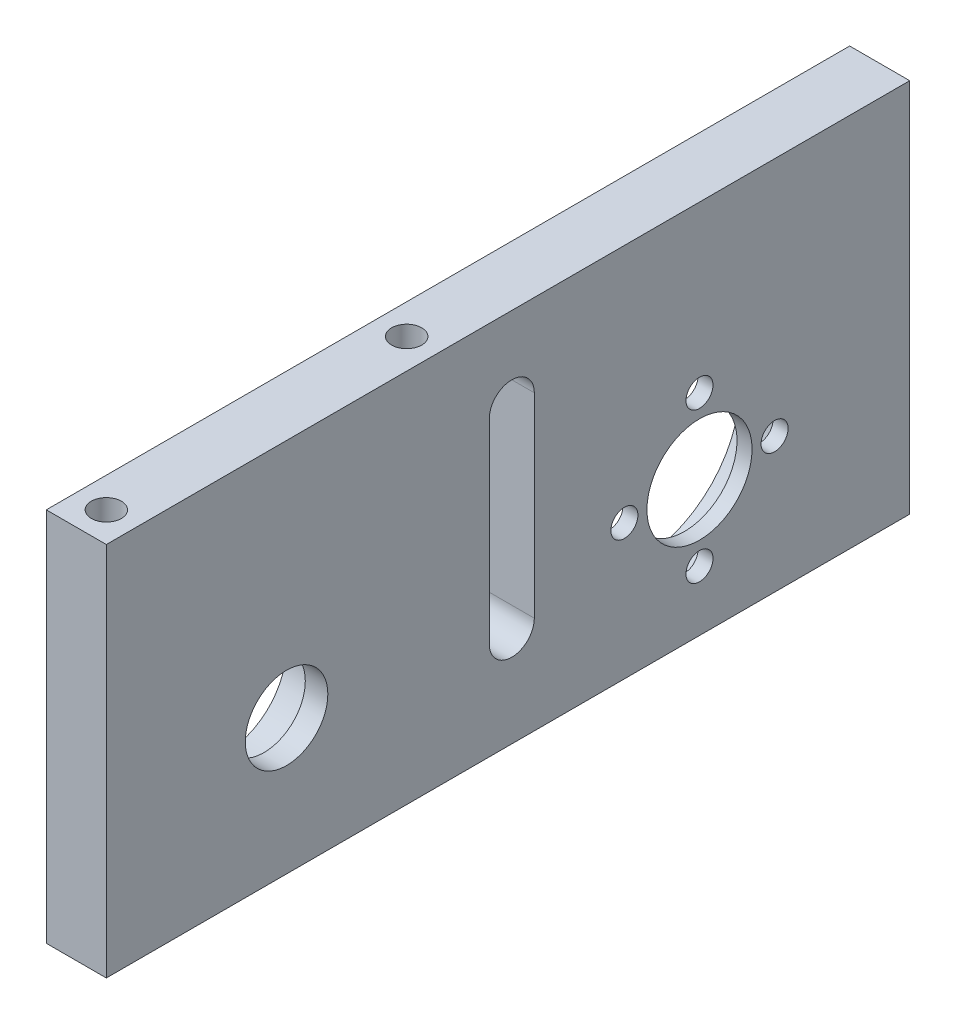
ISO-10303-21;
HEADER;
FILE_DESCRIPTION(('STEP AP214'),'2;1');
FILE_NAME('part.step','',(''),(''),'','','');
FILE_SCHEMA(('AUTOMOTIVE_DESIGN { 1 0 10303 214 1 1 1 1 }'));
ENDSEC;
DATA;
#1=APPLICATION_CONTEXT('core data for automotive mechanical design processes');
#2=APPLICATION_PROTOCOL_DEFINITION('international standard','automotive_design',2000,#1);
#3=PRODUCT_CONTEXT('',#1,'mechanical');
#4=PRODUCT('Part','Part','',(#3));
#5=PRODUCT_RELATED_PRODUCT_CATEGORY('part','',(#4));
#6=PRODUCT_DEFINITION_FORMATION('','',#4);
#7=PRODUCT_DEFINITION_CONTEXT('part definition',#1,'design');
#8=PRODUCT_DEFINITION('design','',#6,#7);
#9=PRODUCT_DEFINITION_SHAPE('','',#8);
#10=(LENGTH_UNIT() NAMED_UNIT(*) SI_UNIT(.MILLI.,.METRE.));
#11=(NAMED_UNIT(*) PLANE_ANGLE_UNIT() SI_UNIT($,.RADIAN.));
#12=(NAMED_UNIT(*) SI_UNIT($,.STERADIAN.) SOLID_ANGLE_UNIT());
#13=UNCERTAINTY_MEASURE_WITH_UNIT(LENGTH_MEASURE(1.E-05),#10,'distance_accuracy_value','');
#14=(GEOMETRIC_REPRESENTATION_CONTEXT(3) GLOBAL_UNCERTAINTY_ASSIGNED_CONTEXT((#13)) GLOBAL_UNIT_ASSIGNED_CONTEXT((#10,
#11,#12)) REPRESENTATION_CONTEXT('',''));
#15=CARTESIAN_POINT('',(0.,0.,0.));
#16=DIRECTION('',(0.,0.,1.));
#17=DIRECTION('',(1.,0.,0.));
#18=AXIS2_PLACEMENT_3D('',#15,#16,#17);
#19=CARTESIAN_POINT('',(-21.,18.,-30.));
#20=DIRECTION('',(1.,0.,0.));
#21=DIRECTION('',(0.,0.,-1.));
#22=AXIS2_PLACEMENT_3D('',#19,#20,#21);
#23=CYLINDRICAL_SURFACE('',#22,7.95);
#24=CARTESIAN_POINT('',(-19.,18.,-30.));
#25=DIRECTION('',(-1.,0.,0.));
#26=DIRECTION('',(0.,0.,1.));
#27=AXIS2_PLACEMENT_3D('',#24,#25,#26);
#28=CIRCLE('',#27,7.95);
#29=CARTESIAN_POINT('',(-19.,18.,-22.05));
#30=VERTEX_POINT('',#29);
#31=EDGE_CURVE('E242',#30,#30,#28,.T.);
#32=ORIENTED_EDGE('',*,*,#31,.T.);
#33=EDGE_LOOP('',(#32));
#34=FACE_BOUND('',#33,.T.);
#35=CARTESIAN_POINT('',(-14.,18.,-30.));
#36=DIRECTION('',(1.,0.,0.));
#37=DIRECTION('',(0.,0.,-1.));
#38=AXIS2_PLACEMENT_3D('',#35,#36,#37);
#39=CIRCLE('',#38,7.95);
#40=CARTESIAN_POINT('',(-14.,18.,-37.95));
#41=VERTEX_POINT('',#40);
#42=EDGE_CURVE('E12',#41,#41,#39,.F.);
#43=ORIENTED_EDGE('',*,*,#42,.F.);
#44=EDGE_LOOP('',(#43));
#45=FACE_BOUND('',#44,.T.);
#46=ADVANCED_FACE('F47',(#34,#45),#23,.F.);
#47=CARTESIAN_POINT('',(-9.,18.,-75.));
#48=DIRECTION('',(-1.,0.,0.));
#49=DIRECTION('',(0.,0.,1.));
#50=AXIS2_PLACEMENT_3D('',#47,#48,#49);
#51=CYLINDRICAL_SURFACE('',#50,1.79999999999999);
#52=CARTESIAN_POINT('',(-11.,18.,-75.));
#53=DIRECTION('',(1.,0.,0.));
#54=DIRECTION('',(0.,0.,-1.));
#55=AXIS2_PLACEMENT_3D('',#52,#53,#54);
#56=CIRCLE('',#55,1.79999999999999);
#57=CARTESIAN_POINT('',(-11.,18.,-76.8));
#58=VERTEX_POINT('',#57);
#59=EDGE_CURVE('E161',#58,#58,#56,.T.);
#60=ORIENTED_EDGE('',*,*,#59,.T.);
#61=EDGE_LOOP('',(#60));
#62=FACE_BOUND('',#61,.T.);
#63=CARTESIAN_POINT('',(-13.,18.,-75.));
#64=DIRECTION('',(-1.,0.,0.));
#65=DIRECTION('',(0.,0.,1.));
#66=AXIS2_PLACEMENT_3D('',#63,#64,#65);
#67=CIRCLE('',#66,1.79999999999999);
#68=CARTESIAN_POINT('',(-13.,18.,-73.2));
#69=VERTEX_POINT('',#68);
#70=EDGE_CURVE('E152',#69,#69,#67,.T.);
#71=ORIENTED_EDGE('',*,*,#70,.T.);
#72=EDGE_LOOP('',(#71));
#73=FACE_BOUND('',#72,.T.);
#74=ADVANCED_FACE('F265',(#62,#73),#51,.F.);
#75=CARTESIAN_POINT('',(-9.,7.99999999999999,-85.));
#76=DIRECTION('',(-1.,0.,0.));
#77=DIRECTION('',(0.,0.,1.));
#78=AXIS2_PLACEMENT_3D('',#75,#76,#77);
#79=CYLINDRICAL_SURFACE('',#78,1.79999999999999);
#80=CARTESIAN_POINT('',(-11.,7.99999999999999,-85.));
#81=DIRECTION('',(1.,0.,0.));
#82=DIRECTION('',(0.,0.,-1.));
#83=AXIS2_PLACEMENT_3D('',#80,#81,#82);
#84=CIRCLE('',#83,1.79999999999999);
#85=CARTESIAN_POINT('',(-11.,7.99999999999999,-86.8));
#86=VERTEX_POINT('',#85);
#87=EDGE_CURVE('E198',#86,#86,#84,.T.);
#88=ORIENTED_EDGE('',*,*,#87,.T.);
#89=EDGE_LOOP('',(#88));
#90=FACE_BOUND('',#89,.T.);
#91=CARTESIAN_POINT('',(-13.,7.99999999999999,-85.));
#92=DIRECTION('',(-1.,0.,0.));
#93=DIRECTION('',(0.,0.,1.));
#94=AXIS2_PLACEMENT_3D('',#91,#92,#93);
#95=CIRCLE('',#94,1.79999999999999);
#96=CARTESIAN_POINT('',(-13.,7.99999999999999,-83.2));
#97=VERTEX_POINT('',#96);
#98=EDGE_CURVE('E155',#97,#97,#95,.T.);
#99=ORIENTED_EDGE('',*,*,#98,.T.);
#100=EDGE_LOOP('',(#99));
#101=FACE_BOUND('',#100,.T.);
#102=ADVANCED_FACE('F270',(#90,#101),#79,.F.);
#103=CARTESIAN_POINT('',(-9.,28.,-85.));
#104=DIRECTION('',(-1.,0.,0.));
#105=DIRECTION('',(0.,0.,1.));
#106=AXIS2_PLACEMENT_3D('',#103,#104,#105);
#107=CYLINDRICAL_SURFACE('',#106,1.79999999999999);
#108=CARTESIAN_POINT('',(-11.,28.,-85.));
#109=DIRECTION('',(1.,0.,0.));
#110=DIRECTION('',(0.,0.,-1.));
#111=AXIS2_PLACEMENT_3D('',#108,#109,#110);
#112=CIRCLE('',#111,1.79999999999999);
#113=CARTESIAN_POINT('',(-11.,28.,-86.8));
#114=VERTEX_POINT('',#113);
#115=EDGE_CURVE('E201',#114,#114,#112,.T.);
#116=ORIENTED_EDGE('',*,*,#115,.T.);
#117=EDGE_LOOP('',(#116));
#118=FACE_BOUND('',#117,.T.);
#119=CARTESIAN_POINT('',(-13.,28.,-85.));
#120=DIRECTION('',(-1.,0.,0.));
#121=DIRECTION('',(0.,0.,1.));
#122=AXIS2_PLACEMENT_3D('',#119,#120,#121);
#123=CIRCLE('',#122,1.79999999999999);
#124=CARTESIAN_POINT('',(-13.,28.,-83.2));
#125=VERTEX_POINT('',#124);
#126=EDGE_CURVE('E149',#125,#125,#123,.T.);
#127=ORIENTED_EDGE('',*,*,#126,.T.);
#128=EDGE_LOOP('',(#127));
#129=FACE_BOUND('',#128,.T.);
#130=ADVANCED_FACE('F261',(#118,#129),#107,.F.);
#131=CARTESIAN_POINT('',(-9.,18.,-95.));
#132=DIRECTION('',(-1.,0.,0.));
#133=DIRECTION('',(0.,0.,1.));
#134=AXIS2_PLACEMENT_3D('',#131,#132,#133);
#135=CYLINDRICAL_SURFACE('',#134,1.79999999999999);
#136=CARTESIAN_POINT('',(-11.,18.,-95.));
#137=DIRECTION('',(1.,0.,0.));
#138=DIRECTION('',(0.,0.,-1.));
#139=AXIS2_PLACEMENT_3D('',#136,#137,#138);
#140=CIRCLE('',#139,1.79999999999999);
#141=CARTESIAN_POINT('',(-11.,18.,-96.8));
#142=VERTEX_POINT('',#141);
#143=EDGE_CURVE('E180',#142,#142,#140,.T.);
#144=ORIENTED_EDGE('',*,*,#143,.T.);
#145=EDGE_LOOP('',(#144));
#146=FACE_BOUND('',#145,.T.);
#147=CARTESIAN_POINT('',(-13.,18.,-95.));
#148=DIRECTION('',(-1.,0.,0.));
#149=DIRECTION('',(0.,0.,1.));
#150=AXIS2_PLACEMENT_3D('',#147,#148,#149);
#151=CIRCLE('',#150,1.79999999999999);
#152=CARTESIAN_POINT('',(-13.,18.,-93.2));
#153=VERTEX_POINT('',#152);
#154=EDGE_CURVE('E146',#153,#153,#151,.T.);
#155=ORIENTED_EDGE('',*,*,#154,.T.);
#156=EDGE_LOOP('',(#155));
#157=FACE_BOUND('',#156,.T.);
#158=ADVANCED_FACE('F255',(#146,#157),#135,.F.);
#159=CARTESIAN_POINT('',(-19.,50.,0.));
#160=DIRECTION('',(-1.,0.,0.));
#161=DIRECTION('',(0.,0.,1.));
#162=AXIS2_PLACEMENT_3D('',#159,#160,#161);
#163=PLANE('',#162);
#164=ORIENTED_EDGE('',*,*,#31,.F.);
#165=EDGE_LOOP('',(#164));
#166=FACE_BOUND('',#165,.T.);
#167=CARTESIAN_POINT('',(-19.,13.,-60.));
#168=DIRECTION('',(-1.,0.,0.));
#169=DIRECTION('',(0.,0.,1.));
#170=AXIS2_PLACEMENT_3D('',#167,#168,#169);
#171=CIRCLE('',#170,3.);
#172=CARTESIAN_POINT('',(-19.,13.,-63.));
#173=VERTEX_POINT('',#172);
#174=CARTESIAN_POINT('',(-19.,13.,-57.));
#175=VERTEX_POINT('',#174);
#176=EDGE_CURVE('E62',#173,#175,#171,.T.);
#177=ORIENTED_EDGE('',*,*,#176,.F.);
#178=DIRECTION('',(0.,-1.,0.));
#179=VECTOR('',#178,1.);
#180=CARTESIAN_POINT('',(-19.,0.,-63.));
#181=LINE('',#180,#179);
#182=CARTESIAN_POINT('',(-19.,39.,-63.));
#183=VERTEX_POINT('',#182);
#184=EDGE_CURVE('E130',#183,#173,#181,.T.);
#185=ORIENTED_EDGE('',*,*,#184,.F.);
#186=CARTESIAN_POINT('',(-19.,39.,-60.));
#187=DIRECTION('',(-1.,0.,0.));
#188=DIRECTION('',(0.,0.,1.));
#189=AXIS2_PLACEMENT_3D('',#186,#187,#188);
#190=CIRCLE('',#189,3.);
#191=CARTESIAN_POINT('',(-19.,39.,-57.));
#192=VERTEX_POINT('',#191);
#193=EDGE_CURVE('E115',#192,#183,#190,.T.);
#194=ORIENTED_EDGE('',*,*,#193,.F.);
#195=DIRECTION('',(0.,-1.,0.));
#196=VECTOR('',#195,1.);
#197=CARTESIAN_POINT('',(-19.,0.,-57.));
#198=LINE('',#197,#196);
#199=EDGE_CURVE('E124',#192,#175,#198,.T.);
#200=ORIENTED_EDGE('',*,*,#199,.T.);
#201=EDGE_LOOP('',(#177,#185,#194,#200));
#202=FACE_BOUND('',#201,.T.);
#203=CARTESIAN_POINT('',(-19.,18.,-85.));
#204=DIRECTION('',(-1.,0.,0.));
#205=DIRECTION('',(0.,0.,1.));
#206=AXIS2_PLACEMENT_3D('',#203,#204,#205);
#207=CIRCLE('',#206,13.4);
#208=CARTESIAN_POINT('',(-19.,18.,-71.6));
#209=VERTEX_POINT('',#208);
#210=EDGE_CURVE('E145',#209,#209,#207,.T.);
#211=ORIENTED_EDGE('',*,*,#210,.F.);
#212=EDGE_LOOP('',(#211));
#213=FACE_BOUND('',#212,.T.);
#214=DIRECTION('',(0.,0.,-1.));
#215=VECTOR('',#214,1.);
#216=CARTESIAN_POINT('',(-19.,0.,0.));
#217=LINE('',#216,#215);
#218=CARTESIAN_POINT('',(-19.,0.,-6.));
#219=VERTEX_POINT('',#218);
#220=CARTESIAN_POINT('',(-19.,0.,-113.));
#221=VERTEX_POINT('',#220);
#222=EDGE_CURVE('E176',#219,#221,#217,.T.);
#223=ORIENTED_EDGE('',*,*,#222,.F.);
#224=DIRECTION('',(0.,-1.,0.));
#225=VECTOR('',#224,1.);
#226=CARTESIAN_POINT('',(-19.,50.,-6.));
#227=LINE('',#226,#225);
#228=CARTESIAN_POINT('',(-19.,50.,-6.));
#229=VERTEX_POINT('',#228);
#230=EDGE_CURVE('E193',#229,#219,#227,.T.);
#231=ORIENTED_EDGE('',*,*,#230,.F.);
#232=DIRECTION('',(0.,0.,-1.));
#233=VECTOR('',#232,1.);
#234=CARTESIAN_POINT('',(-19.,50.,0.));
#235=LINE('',#234,#233);
#236=CARTESIAN_POINT('',(-19.,50.,-113.));
#237=VERTEX_POINT('',#236);
#238=EDGE_CURVE('E164',#229,#237,#235,.T.);
#239=ORIENTED_EDGE('',*,*,#238,.T.);
#240=DIRECTION('',(0.,-1.,0.));
#241=VECTOR('',#240,1.);
#242=CARTESIAN_POINT('',(-19.,50.,-113.));
#243=LINE('',#242,#241);
#244=EDGE_CURVE('E175',#237,#221,#243,.T.);
#245=ORIENTED_EDGE('',*,*,#244,.T.);
#246=EDGE_LOOP('',(#223,#231,#239,#245));
#247=FACE_BOUND('',#246,.T.);
#248=ADVANCED_FACE('F49',(#166,#202,#213,#247),#163,.T.);
#249=CARTESIAN_POINT('',(0.,50.,-6.));
#250=DIRECTION('',(0.,0.,-1.));
#251=DIRECTION('',(-1.,0.,0.));
#252=AXIS2_PLACEMENT_3D('',#249,#250,#251);
#253=PLANE('',#252);
#254=DIRECTION('',(1.,0.,0.));
#255=VECTOR('',#254,1.);
#256=CARTESIAN_POINT('',(0.,0.,-6.));
#257=LINE('',#256,#255);
#258=CARTESIAN_POINT('',(-11.,0.,-6.));
#259=VERTEX_POINT('',#258);
#260=EDGE_CURVE('E179',#219,#259,#257,.T.);
#261=ORIENTED_EDGE('',*,*,#260,.T.);
#262=DIRECTION('',(0.,-1.,0.));
#263=VECTOR('',#262,1.);
#264=CARTESIAN_POINT('',(-11.,50.,-6.));
#265=LINE('',#264,#263);
#266=CARTESIAN_POINT('',(-11.,50.,-6.));
#267=VERTEX_POINT('',#266);
#268=EDGE_CURVE('E191',#267,#259,#265,.T.);
#269=ORIENTED_EDGE('',*,*,#268,.F.);
#270=DIRECTION('',(1.,0.,0.));
#271=VECTOR('',#270,1.);
#272=CARTESIAN_POINT('',(0.,50.,-6.));
#273=LINE('',#272,#271);
#274=EDGE_CURVE('E167',#229,#267,#273,.T.);
#275=ORIENTED_EDGE('',*,*,#274,.F.);
#276=ORIENTED_EDGE('',*,*,#230,.T.);
#277=EDGE_LOOP('',(#261,#269,#275,#276));
#278=FACE_BOUND('',#277,.T.);
#279=ADVANCED_FACE('F220',(#278),#253,.F.);
#280=CARTESIAN_POINT('',(-11.,50.,0.));
#281=DIRECTION('',(1.,0.,0.));
#282=DIRECTION('',(0.,0.,-1.));
#283=AXIS2_PLACEMENT_3D('',#280,#281,#282);
#284=PLANE('',#283);
#285=CARTESIAN_POINT('',(-11.,13.,-60.));
#286=DIRECTION('',(1.,0.,0.));
#287=DIRECTION('',(0.,0.,-1.));
#288=AXIS2_PLACEMENT_3D('',#285,#286,#287);
#289=CIRCLE('',#288,3.);
#290=CARTESIAN_POINT('',(-11.,13.,-57.));
#291=VERTEX_POINT('',#290);
#292=CARTESIAN_POINT('',(-11.,13.,-63.));
#293=VERTEX_POINT('',#292);
#294=EDGE_CURVE('E55',#291,#293,#289,.T.);
#295=ORIENTED_EDGE('',*,*,#294,.F.);
#296=DIRECTION('',(0.,1.,0.));
#297=VECTOR('',#296,1.);
#298=CARTESIAN_POINT('',(-11.,50.,-57.));
#299=LINE('',#298,#297);
#300=CARTESIAN_POINT('',(-11.,39.,-57.));
#301=VERTEX_POINT('',#300);
#302=EDGE_CURVE('E195',#291,#301,#299,.T.);
#303=ORIENTED_EDGE('',*,*,#302,.T.);
#304=CARTESIAN_POINT('',(-11.,39.,-60.));
#305=DIRECTION('',(1.,0.,0.));
#306=DIRECTION('',(0.,0.,-1.));
#307=AXIS2_PLACEMENT_3D('',#304,#305,#306);
#308=CIRCLE('',#307,3.);
#309=CARTESIAN_POINT('',(-11.,39.,-63.));
#310=VERTEX_POINT('',#309);
#311=EDGE_CURVE('E118',#310,#301,#308,.T.);
#312=ORIENTED_EDGE('',*,*,#311,.F.);
#313=DIRECTION('',(0.,1.,0.));
#314=VECTOR('',#313,1.);
#315=CARTESIAN_POINT('',(-11.,50.,-63.));
#316=LINE('',#315,#314);
#317=EDGE_CURVE('E208',#293,#310,#316,.T.);
#318=ORIENTED_EDGE('',*,*,#317,.F.);
#319=EDGE_LOOP('',(#295,#303,#312,#318));
#320=FACE_BOUND('',#319,.T.);
#321=CARTESIAN_POINT('',(-11.,18.,-85.));
#322=DIRECTION('',(1.,0.,0.));
#323=DIRECTION('',(0.,0.,-1.));
#324=AXIS2_PLACEMENT_3D('',#321,#322,#323);
#325=CIRCLE('',#324,7.);
#326=CARTESIAN_POINT('',(-11.,18.,-92.));
#327=VERTEX_POINT('',#326);
#328=EDGE_CURVE('E142',#327,#327,#325,.T.);
#329=ORIENTED_EDGE('',*,*,#328,.F.);
#330=EDGE_LOOP('',(#329));
#331=FACE_BOUND('',#330,.T.);
#332=ORIENTED_EDGE('',*,*,#143,.F.);
#333=EDGE_LOOP('',(#332));
#334=FACE_BOUND('',#333,.T.);
#335=ORIENTED_EDGE('',*,*,#115,.F.);
#336=EDGE_LOOP('',(#335));
#337=FACE_BOUND('',#336,.T.);
#338=ORIENTED_EDGE('',*,*,#87,.F.);
#339=EDGE_LOOP('',(#338));
#340=FACE_BOUND('',#339,.T.);
#341=ORIENTED_EDGE('',*,*,#59,.F.);
#342=EDGE_LOOP('',(#341));
#343=FACE_BOUND('',#342,.T.);
#344=DIRECTION('',(0.,0.,1.));
#345=VECTOR('',#344,1.);
#346=CARTESIAN_POINT('',(-11.,0.,0.));
#347=LINE('',#346,#345);
#348=CARTESIAN_POINT('',(-11.,0.,-113.));
#349=VERTEX_POINT('',#348);
#350=EDGE_CURVE('E183',#349,#259,#347,.T.);
#351=ORIENTED_EDGE('',*,*,#350,.F.);
#352=DIRECTION('',(0.,-1.,0.));
#353=VECTOR('',#352,1.);
#354=CARTESIAN_POINT('',(-11.,50.,-113.));
#355=LINE('',#354,#353);
#356=CARTESIAN_POINT('',(-11.,50.,-113.));
#357=VERTEX_POINT('',#356);
#358=EDGE_CURVE('E189',#357,#349,#355,.T.);
#359=ORIENTED_EDGE('',*,*,#358,.F.);
#360=DIRECTION('',(0.,0.,1.));
#361=VECTOR('',#360,1.);
#362=CARTESIAN_POINT('',(-11.,50.,0.));
#363=LINE('',#362,#361);
#364=EDGE_CURVE('E170',#357,#267,#363,.T.);
#365=ORIENTED_EDGE('',*,*,#364,.T.);
#366=ORIENTED_EDGE('',*,*,#268,.T.);
#367=EDGE_LOOP('',(#351,#359,#365,#366));
#368=FACE_BOUND('',#367,.T.);
#369=CARTESIAN_POINT('',(-11.,18.,-30.));
#370=DIRECTION('',(1.,0.,0.));
#371=DIRECTION('',(0.,0.,-1.));
#372=AXIS2_PLACEMENT_3D('',#369,#370,#371);
#373=CIRCLE('',#372,5.5);
#374=CARTESIAN_POINT('',(-11.,18.,-35.5));
#375=VERTEX_POINT('',#374);
#376=EDGE_CURVE('E236',#375,#375,#373,.T.);
#377=ORIENTED_EDGE('',*,*,#376,.F.);
#378=EDGE_LOOP('',(#377));
#379=FACE_BOUND('',#378,.T.);
#380=ADVANCED_FACE('F216',(#320,#331,#334,#337,#340,#343,#368,#379),#284,.T.);
#381=CARTESIAN_POINT('',(0.,50.,-113.));
#382=DIRECTION('',(0.,0.,1.));
#383=DIRECTION('',(1.,0.,0.));
#384=AXIS2_PLACEMENT_3D('',#381,#382,#383);
#385=PLANE('',#384);
#386=DIRECTION('',(-1.,0.,0.));
#387=VECTOR('',#386,1.);
#388=CARTESIAN_POINT('',(0.,0.,-113.));
#389=LINE('',#388,#387);
#390=EDGE_CURVE('E168',#349,#221,#389,.T.);
#391=ORIENTED_EDGE('',*,*,#390,.T.);
#392=ORIENTED_EDGE('',*,*,#244,.F.);
#393=DIRECTION('',(-1.,0.,0.));
#394=VECTOR('',#393,1.);
#395=CARTESIAN_POINT('',(0.,50.,-113.));
#396=LINE('',#395,#394);
#397=EDGE_CURVE('E173',#357,#237,#396,.T.);
#398=ORIENTED_EDGE('',*,*,#397,.F.);
#399=ORIENTED_EDGE('',*,*,#358,.T.);
#400=EDGE_LOOP('',(#391,#392,#398,#399));
#401=FACE_BOUND('',#400,.T.);
#402=ADVANCED_FACE('F219',(#401),#385,.F.);
#403=CARTESIAN_POINT('',(0.,50.,0.));
#404=DIRECTION('',(0.,1.,0.));
#405=DIRECTION('',(0.,0.,1.));
#406=AXIS2_PLACEMENT_3D('',#403,#404,#405);
#407=PLANE('',#406);
#408=CARTESIAN_POINT('',(-15.,50.,-50.));
#409=DIRECTION('',(0.,1.,0.));
#410=DIRECTION('',(0.,0.,1.));
#411=AXIS2_PLACEMENT_3D('',#408,#409,#410);
#412=CIRCLE('',#411,2.);
#413=CARTESIAN_POINT('',(-15.,50.,-48.));
#414=VERTEX_POINT('',#413);
#415=EDGE_CURVE('E556',#414,#414,#412,.T.);
#416=ORIENTED_EDGE('',*,*,#415,.F.);
#417=EDGE_LOOP('',(#416));
#418=FACE_BOUND('',#417,.T.);
#419=CARTESIAN_POINT('',(-15.,50.,-10.));
#420=DIRECTION('',(0.,1.,0.));
#421=DIRECTION('',(0.,0.,1.));
#422=AXIS2_PLACEMENT_3D('',#419,#420,#421);
#423=CIRCLE('',#422,2.);
#424=CARTESIAN_POINT('',(-15.,50.,-8.));
#425=VERTEX_POINT('',#424);
#426=EDGE_CURVE('E566',#425,#425,#423,.T.);
#427=ORIENTED_EDGE('',*,*,#426,.F.);
#428=EDGE_LOOP('',(#427));
#429=FACE_BOUND('',#428,.T.);
#430=ORIENTED_EDGE('',*,*,#238,.F.);
#431=ORIENTED_EDGE('',*,*,#274,.T.);
#432=ORIENTED_EDGE('',*,*,#364,.F.);
#433=ORIENTED_EDGE('',*,*,#397,.T.);
#434=EDGE_LOOP('',(#430,#431,#432,#433));
#435=FACE_BOUND('',#434,.T.);
#436=ADVANCED_FACE('F304',(#418,#429,#435),#407,.T.);
#437=CARTESIAN_POINT('',(0.,0.,0.));
#438=DIRECTION('',(0.,1.,0.));
#439=DIRECTION('',(0.,0.,1.));
#440=AXIS2_PLACEMENT_3D('',#437,#438,#439);
#441=PLANE('',#440);
#442=CARTESIAN_POINT('',(-15.,0.,-109.));
#443=DIRECTION('',(0.,-1.,0.));
#444=DIRECTION('',(0.,0.,-1.));
#445=AXIS2_PLACEMENT_3D('',#442,#443,#444);
#446=CIRCLE('',#445,2.);
#447=CARTESIAN_POINT('',(-15.,0.,-111.));
#448=VERTEX_POINT('',#447);
#449=EDGE_CURVE('E245',#448,#448,#446,.T.);
#450=ORIENTED_EDGE('',*,*,#449,.F.);
#451=EDGE_LOOP('',(#450));
#452=FACE_BOUND('',#451,.T.);
#453=CARTESIAN_POINT('',(-15.,0.,-50.));
#454=DIRECTION('',(0.,-1.,0.));
#455=DIRECTION('',(0.,0.,-1.));
#456=AXIS2_PLACEMENT_3D('',#453,#454,#455);
#457=CIRCLE('',#456,2.);
#458=CARTESIAN_POINT('',(-15.,0.,-52.));
#459=VERTEX_POINT('',#458);
#460=EDGE_CURVE('E574',#459,#459,#457,.T.);
#461=ORIENTED_EDGE('',*,*,#460,.F.);
#462=EDGE_LOOP('',(#461));
#463=FACE_BOUND('',#462,.T.);
#464=CARTESIAN_POINT('',(-15.,0.,-9.99999999999999));
#465=DIRECTION('',(0.,-1.,0.));
#466=DIRECTION('',(0.,0.,-1.));
#467=AXIS2_PLACEMENT_3D('',#464,#465,#466);
#468=CIRCLE('',#467,2.);
#469=CARTESIAN_POINT('',(-15.,0.,-12.));
#470=VERTEX_POINT('',#469);
#471=EDGE_CURVE('E555',#470,#470,#468,.T.);
#472=ORIENTED_EDGE('',*,*,#471,.F.);
#473=EDGE_LOOP('',(#472));
#474=FACE_BOUND('',#473,.T.);
#475=ORIENTED_EDGE('',*,*,#222,.T.);
#476=ORIENTED_EDGE('',*,*,#390,.F.);
#477=ORIENTED_EDGE('',*,*,#350,.T.);
#478=ORIENTED_EDGE('',*,*,#260,.F.);
#479=EDGE_LOOP('',(#475,#476,#477,#478));
#480=FACE_BOUND('',#479,.T.);
#481=ADVANCED_FACE('F295',(#452,#463,#474,#480),#441,.F.);
#482=CARTESIAN_POINT('',(-13.,18.,-85.));
#483=DIRECTION('',(-1.,0.,0.));
#484=DIRECTION('',(0.,0.,1.));
#485=AXIS2_PLACEMENT_3D('',#482,#483,#484);
#486=CYLINDRICAL_SURFACE('',#485,13.4);
#487=CARTESIAN_POINT('',(-13.,18.,-85.));
#488=DIRECTION('',(-1.,0.,0.));
#489=DIRECTION('',(0.,0.,1.));
#490=AXIS2_PLACEMENT_3D('',#487,#488,#489);
#491=CIRCLE('',#490,13.4);
#492=CARTESIAN_POINT('',(-13.,18.,-71.6));
#493=VERTEX_POINT('',#492);
#494=EDGE_CURVE('E158',#493,#493,#491,.T.);
#495=ORIENTED_EDGE('',*,*,#494,.F.);
#496=EDGE_LOOP('',(#495));
#497=FACE_BOUND('',#496,.T.);
#498=ORIENTED_EDGE('',*,*,#210,.T.);
#499=EDGE_LOOP('',(#498));
#500=FACE_BOUND('',#499,.T.);
#501=ADVANCED_FACE('F292',(#497,#500),#486,.F.);
#502=CARTESIAN_POINT('',(-13.,0.,0.));
#503=DIRECTION('',(-1.,0.,0.));
#504=DIRECTION('',(0.,0.,1.));
#505=AXIS2_PLACEMENT_3D('',#502,#503,#504);
#506=PLANE('',#505);
#507=ORIENTED_EDGE('',*,*,#154,.F.);
#508=EDGE_LOOP('',(#507));
#509=FACE_BOUND('',#508,.T.);
#510=ORIENTED_EDGE('',*,*,#126,.F.);
#511=EDGE_LOOP('',(#510));
#512=FACE_BOUND('',#511,.T.);
#513=ORIENTED_EDGE('',*,*,#70,.F.);
#514=EDGE_LOOP('',(#513));
#515=FACE_BOUND('',#514,.T.);
#516=ORIENTED_EDGE('',*,*,#98,.F.);
#517=EDGE_LOOP('',(#516));
#518=FACE_BOUND('',#517,.T.);
#519=CARTESIAN_POINT('',(-13.,18.,-85.));
#520=DIRECTION('',(-1.,0.,0.));
#521=DIRECTION('',(0.,0.,1.));
#522=AXIS2_PLACEMENT_3D('',#519,#520,#521);
#523=CIRCLE('',#522,7.);
#524=CARTESIAN_POINT('',(-13.,18.,-78.));
#525=VERTEX_POINT('',#524);
#526=EDGE_CURVE('E137',#525,#525,#523,.T.);
#527=ORIENTED_EDGE('',*,*,#526,.F.);
#528=EDGE_LOOP('',(#527));
#529=FACE_BOUND('',#528,.T.);
#530=ORIENTED_EDGE('',*,*,#494,.T.);
#531=EDGE_LOOP('',(#530));
#532=FACE_BOUND('',#531,.T.);
#533=ADVANCED_FACE('F288',(#509,#512,#515,#518,#529,#532),#506,.T.);
#534=CARTESIAN_POINT('',(-9.,18.,-85.));
#535=DIRECTION('',(-1.,0.,0.));
#536=DIRECTION('',(0.,0.,1.));
#537=AXIS2_PLACEMENT_3D('',#534,#535,#536);
#538=CYLINDRICAL_SURFACE('',#537,7.);
#539=ORIENTED_EDGE('',*,*,#328,.T.);
#540=EDGE_LOOP('',(#539));
#541=FACE_BOUND('',#540,.T.);
#542=ORIENTED_EDGE('',*,*,#526,.T.);
#543=EDGE_LOOP('',(#542));
#544=FACE_BOUND('',#543,.T.);
#545=ADVANCED_FACE('F285',(#541,#544),#538,.F.);
#546=CARTESIAN_POINT('',(-9.,13.,-60.));
#547=DIRECTION('',(-1.,0.,0.));
#548=DIRECTION('',(0.,0.,1.));
#549=AXIS2_PLACEMENT_3D('',#546,#547,#548);
#550=CYLINDRICAL_SURFACE('',#549,3.);
#551=ORIENTED_EDGE('',*,*,#294,.T.);
#552=DIRECTION('',(-1.,0.,0.));
#553=VECTOR('',#552,1.);
#554=CARTESIAN_POINT('',(-9.,13.,-63.));
#555=LINE('',#554,#553);
#556=EDGE_CURVE('E135',#293,#173,#555,.T.);
#557=ORIENTED_EDGE('',*,*,#556,.T.);
#558=ORIENTED_EDGE('',*,*,#176,.T.);
#559=DIRECTION('',(-1.,0.,0.));
#560=VECTOR('',#559,1.);
#561=CARTESIAN_POINT('',(-9.,13.,-57.));
#562=LINE('',#561,#560);
#563=EDGE_CURVE('E121',#291,#175,#562,.T.);
#564=ORIENTED_EDGE('',*,*,#563,.F.);
#565=EDGE_LOOP('',(#551,#557,#558,#564));
#566=FACE_BOUND('',#565,.T.);
#567=ADVANCED_FACE('F211',(#566),#550,.F.);
#568=CARTESIAN_POINT('',(-9.,0.,-63.));
#569=DIRECTION('',(0.,0.,-1.));
#570=DIRECTION('',(-1.,0.,0.));
#571=AXIS2_PLACEMENT_3D('',#568,#569,#570);
#572=PLANE('',#571);
#573=ORIENTED_EDGE('',*,*,#317,.T.);
#574=DIRECTION('',(-1.,0.,0.));
#575=VECTOR('',#574,1.);
#576=CARTESIAN_POINT('',(-9.,39.,-63.));
#577=LINE('',#576,#575);
#578=EDGE_CURVE('E120',#310,#183,#577,.T.);
#579=ORIENTED_EDGE('',*,*,#578,.T.);
#580=ORIENTED_EDGE('',*,*,#184,.T.);
#581=ORIENTED_EDGE('',*,*,#556,.F.);
#582=EDGE_LOOP('',(#573,#579,#580,#581));
#583=FACE_BOUND('',#582,.T.);
#584=ADVANCED_FACE('F215',(#583),#572,.F.);
#585=CARTESIAN_POINT('',(-9.,39.,-60.));
#586=DIRECTION('',(-1.,0.,0.));
#587=DIRECTION('',(0.,0.,1.));
#588=AXIS2_PLACEMENT_3D('',#585,#586,#587);
#589=CYLINDRICAL_SURFACE('',#588,3.);
#590=ORIENTED_EDGE('',*,*,#311,.T.);
#591=DIRECTION('',(-1.,0.,0.));
#592=VECTOR('',#591,1.);
#593=CARTESIAN_POINT('',(-9.,39.,-57.));
#594=LINE('',#593,#592);
#595=EDGE_CURVE('E70',#301,#192,#594,.T.);
#596=ORIENTED_EDGE('',*,*,#595,.T.);
#597=ORIENTED_EDGE('',*,*,#193,.T.);
#598=ORIENTED_EDGE('',*,*,#578,.F.);
#599=EDGE_LOOP('',(#590,#596,#597,#598));
#600=FACE_BOUND('',#599,.T.);
#601=ADVANCED_FACE('F112',(#600),#589,.F.);
#602=CARTESIAN_POINT('',(-9.,0.,-57.));
#603=DIRECTION('',(0.,0.,-1.));
#604=DIRECTION('',(-1.,0.,0.));
#605=AXIS2_PLACEMENT_3D('',#602,#603,#604);
#606=PLANE('',#605);
#607=ORIENTED_EDGE('',*,*,#563,.T.);
#608=ORIENTED_EDGE('',*,*,#199,.F.);
#609=ORIENTED_EDGE('',*,*,#595,.F.);
#610=ORIENTED_EDGE('',*,*,#302,.F.);
#611=EDGE_LOOP('',(#607,#608,#609,#610));
#612=FACE_BOUND('',#611,.T.);
#613=ADVANCED_FACE('F125',(#612),#606,.T.);
#614=CARTESIAN_POINT('',(-14.,18.,-30.));
#615=DIRECTION('',(1.,0.,0.));
#616=DIRECTION('',(0.,0.,-1.));
#617=AXIS2_PLACEMENT_3D('',#614,#615,#616);
#618=PLANE('',#617);
#619=CARTESIAN_POINT('',(-14.,18.,-30.));
#620=DIRECTION('',(1.,0.,0.));
#621=DIRECTION('',(0.,0.,-1.));
#622=AXIS2_PLACEMENT_3D('',#619,#620,#621);
#623=CIRCLE('',#622,5.5);
#624=CARTESIAN_POINT('',(-14.,18.,-35.5));
#625=VERTEX_POINT('',#624);
#626=EDGE_CURVE('E238',#625,#625,#623,.T.);
#627=ORIENTED_EDGE('',*,*,#626,.T.);
#628=EDGE_LOOP('',(#627));
#629=FACE_BOUND('',#628,.T.);
#630=ORIENTED_EDGE('',*,*,#42,.T.);
#631=EDGE_LOOP('',(#630));
#632=FACE_BOUND('',#631,.T.);
#633=ADVANCED_FACE('F275',(#629,#632),#618,.F.);
#634=CARTESIAN_POINT('',(-14.,18.,-30.));
#635=DIRECTION('',(1.,0.,0.));
#636=DIRECTION('',(0.,0.,-1.));
#637=AXIS2_PLACEMENT_3D('',#634,#635,#636);
#638=CYLINDRICAL_SURFACE('',#637,5.5);
#639=ORIENTED_EDGE('',*,*,#626,.F.);
#640=EDGE_LOOP('',(#639));
#641=FACE_BOUND('',#640,.T.);
#642=ORIENTED_EDGE('',*,*,#376,.T.);
#643=EDGE_LOOP('',(#642));
#644=FACE_BOUND('',#643,.T.);
#645=ADVANCED_FACE('F378',(#641,#644),#638,.F.);
#646=CARTESIAN_POINT('',(-15.,15.,-9.99999999999999));
#647=DIRECTION('',(0.,-1.,0.));
#648=DIRECTION('',(0.,0.,-1.));
#649=AXIS2_PLACEMENT_3D('',#646,#647,#648);
#650=CYLINDRICAL_SURFACE('',#649,2.);
#651=CARTESIAN_POINT('',(-15.,15.,-9.99999999999999));
#652=DIRECTION('',(0.,-1.,0.));
#653=DIRECTION('',(0.,0.,-1.));
#654=AXIS2_PLACEMENT_3D('',#651,#652,#653);
#655=CIRCLE('',#654,2.);
#656=CARTESIAN_POINT('',(-15.,15.,-12.));
#657=VERTEX_POINT('',#656);
#658=EDGE_CURVE('E559',#657,#657,#655,.T.);
#659=ORIENTED_EDGE('',*,*,#658,.F.);
#660=EDGE_LOOP('',(#659));
#661=FACE_BOUND('',#660,.T.);
#662=ORIENTED_EDGE('',*,*,#471,.T.);
#663=EDGE_LOOP('',(#662));
#664=FACE_BOUND('',#663,.T.);
#665=ADVANCED_FACE('F384',(#661,#664),#650,.F.);
#666=CARTESIAN_POINT('',(-15.,15.,-9.99999999999999));
#667=DIRECTION('',(0.,-1.,0.));
#668=DIRECTION('',(0.,0.,-1.));
#669=AXIS2_PLACEMENT_3D('',#666,#667,#668);
#670=PLANE('',#669);
#671=ORIENTED_EDGE('',*,*,#658,.T.);
#672=EDGE_LOOP('',(#671));
#673=FACE_BOUND('',#672,.T.);
#674=ADVANCED_FACE('F390',(#673),#670,.T.);
#675=CARTESIAN_POINT('',(-15.,15.,-50.));
#676=DIRECTION('',(0.,-1.,0.));
#677=DIRECTION('',(0.,0.,-1.));
#678=AXIS2_PLACEMENT_3D('',#675,#676,#677);
#679=CYLINDRICAL_SURFACE('',#678,2.);
#680=CARTESIAN_POINT('',(-15.,15.,-50.));
#681=DIRECTION('',(0.,-1.,0.));
#682=DIRECTION('',(0.,0.,-1.));
#683=AXIS2_PLACEMENT_3D('',#680,#681,#682);
#684=CIRCLE('',#683,2.);
#685=CARTESIAN_POINT('',(-15.,15.,-52.));
#686=VERTEX_POINT('',#685);
#687=EDGE_CURVE('E571',#686,#686,#684,.T.);
#688=ORIENTED_EDGE('',*,*,#687,.F.);
#689=EDGE_LOOP('',(#688));
#690=FACE_BOUND('',#689,.T.);
#691=ORIENTED_EDGE('',*,*,#460,.T.);
#692=EDGE_LOOP('',(#691));
#693=FACE_BOUND('',#692,.T.);
#694=ADVANCED_FACE('F398',(#690,#693),#679,.F.);
#695=CARTESIAN_POINT('',(-15.,15.,-50.));
#696=DIRECTION('',(0.,-1.,0.));
#697=DIRECTION('',(0.,0.,-1.));
#698=AXIS2_PLACEMENT_3D('',#695,#696,#697);
#699=PLANE('',#698);
#700=ORIENTED_EDGE('',*,*,#687,.T.);
#701=EDGE_LOOP('',(#700));
#702=FACE_BOUND('',#701,.T.);
#703=ADVANCED_FACE('F406',(#702),#699,.T.);
#704=CARTESIAN_POINT('',(-15.,15.,-109.));
#705=DIRECTION('',(0.,-1.,0.));
#706=DIRECTION('',(0.,0.,-1.));
#707=AXIS2_PLACEMENT_3D('',#704,#705,#706);
#708=CYLINDRICAL_SURFACE('',#707,2.);
#709=CARTESIAN_POINT('',(-15.,15.,-109.));
#710=DIRECTION('',(0.,-1.,0.));
#711=DIRECTION('',(0.,0.,-1.));
#712=AXIS2_PLACEMENT_3D('',#709,#710,#711);
#713=CIRCLE('',#712,2.);
#714=CARTESIAN_POINT('',(-15.,15.,-111.));
#715=VERTEX_POINT('',#714);
#716=EDGE_CURVE('E239',#715,#715,#713,.T.);
#717=ORIENTED_EDGE('',*,*,#716,.F.);
#718=EDGE_LOOP('',(#717));
#719=FACE_BOUND('',#718,.T.);
#720=ORIENTED_EDGE('',*,*,#449,.T.);
#721=EDGE_LOOP('',(#720));
#722=FACE_BOUND('',#721,.T.);
#723=ADVANCED_FACE('F414',(#719,#722),#708,.F.);
#724=CARTESIAN_POINT('',(-15.,15.,-109.));
#725=DIRECTION('',(0.,-1.,0.));
#726=DIRECTION('',(0.,0.,-1.));
#727=AXIS2_PLACEMENT_3D('',#724,#725,#726);
#728=PLANE('',#727);
#729=ORIENTED_EDGE('',*,*,#716,.T.);
#730=EDGE_LOOP('',(#729));
#731=FACE_BOUND('',#730,.T.);
#732=ADVANCED_FACE('F422',(#731),#728,.T.);
#733=CARTESIAN_POINT('',(-15.,35.,-10.));
#734=DIRECTION('',(0.,1.,0.));
#735=DIRECTION('',(0.,0.,1.));
#736=AXIS2_PLACEMENT_3D('',#733,#734,#735);
#737=CYLINDRICAL_SURFACE('',#736,2.);
#738=CARTESIAN_POINT('',(-15.,35.,-10.));
#739=DIRECTION('',(0.,1.,0.));
#740=DIRECTION('',(0.,0.,1.));
#741=AXIS2_PLACEMENT_3D('',#738,#739,#740);
#742=CIRCLE('',#741,2.);
#743=CARTESIAN_POINT('',(-15.,35.,-8.));
#744=VERTEX_POINT('',#743);
#745=EDGE_CURVE('E561',#744,#744,#742,.T.);
#746=ORIENTED_EDGE('',*,*,#745,.F.);
#747=EDGE_LOOP('',(#746));
#748=FACE_BOUND('',#747,.T.);
#749=ORIENTED_EDGE('',*,*,#426,.T.);
#750=EDGE_LOOP('',(#749));
#751=FACE_BOUND('',#750,.T.);
#752=ADVANCED_FACE('F429',(#748,#751),#737,.F.);
#753=CARTESIAN_POINT('',(-15.,35.,-10.));
#754=DIRECTION('',(0.,1.,0.));
#755=DIRECTION('',(0.,0.,1.));
#756=AXIS2_PLACEMENT_3D('',#753,#754,#755);
#757=PLANE('',#756);
#758=ORIENTED_EDGE('',*,*,#745,.T.);
#759=EDGE_LOOP('',(#758));
#760=FACE_BOUND('',#759,.T.);
#761=ADVANCED_FACE('F436',(#760),#757,.T.);
#762=CARTESIAN_POINT('',(-15.,35.,-50.));
#763=DIRECTION('',(0.,1.,0.));
#764=DIRECTION('',(0.,0.,1.));
#765=AXIS2_PLACEMENT_3D('',#762,#763,#764);
#766=CYLINDRICAL_SURFACE('',#765,2.);
#767=CARTESIAN_POINT('',(-15.,35.,-50.));
#768=DIRECTION('',(0.,1.,0.));
#769=DIRECTION('',(0.,0.,1.));
#770=AXIS2_PLACEMENT_3D('',#767,#768,#769);
#771=CIRCLE('',#770,2.);
#772=CARTESIAN_POINT('',(-15.,35.,-48.));
#773=VERTEX_POINT('',#772);
#774=EDGE_CURVE('E554',#773,#773,#771,.T.);
#775=ORIENTED_EDGE('',*,*,#774,.F.);
#776=EDGE_LOOP('',(#775));
#777=FACE_BOUND('',#776,.T.);
#778=ORIENTED_EDGE('',*,*,#415,.T.);
#779=EDGE_LOOP('',(#778));
#780=FACE_BOUND('',#779,.T.);
#781=ADVANCED_FACE('F444',(#777,#780),#766,.F.);
#782=CARTESIAN_POINT('',(-15.,35.,-50.));
#783=DIRECTION('',(0.,1.,0.));
#784=DIRECTION('',(0.,0.,1.));
#785=AXIS2_PLACEMENT_3D('',#782,#783,#784);
#786=PLANE('',#785);
#787=ORIENTED_EDGE('',*,*,#774,.T.);
#788=EDGE_LOOP('',(#787));
#789=FACE_BOUND('',#788,.T.);
#790=ADVANCED_FACE('F452',(#789),#786,.T.);
#791=CLOSED_SHELL('',(#46,#74,#102,#130,#158,#248,#279,#380,#402,#436,#481,#501,#533,#545,#567,
#584,#601,#613,#633,#645,#665,#674,#694,#703,#723,#732,#752,#761,#781,#790));
#792=MANIFOLD_SOLID_BREP('B2',#791);
#793=ADVANCED_BREP_SHAPE_REPRESENTATION('',(#18,#792),#14);
#794=SHAPE_DEFINITION_REPRESENTATION(#9,#793);
ENDSEC;
END-ISO-10303-21;
